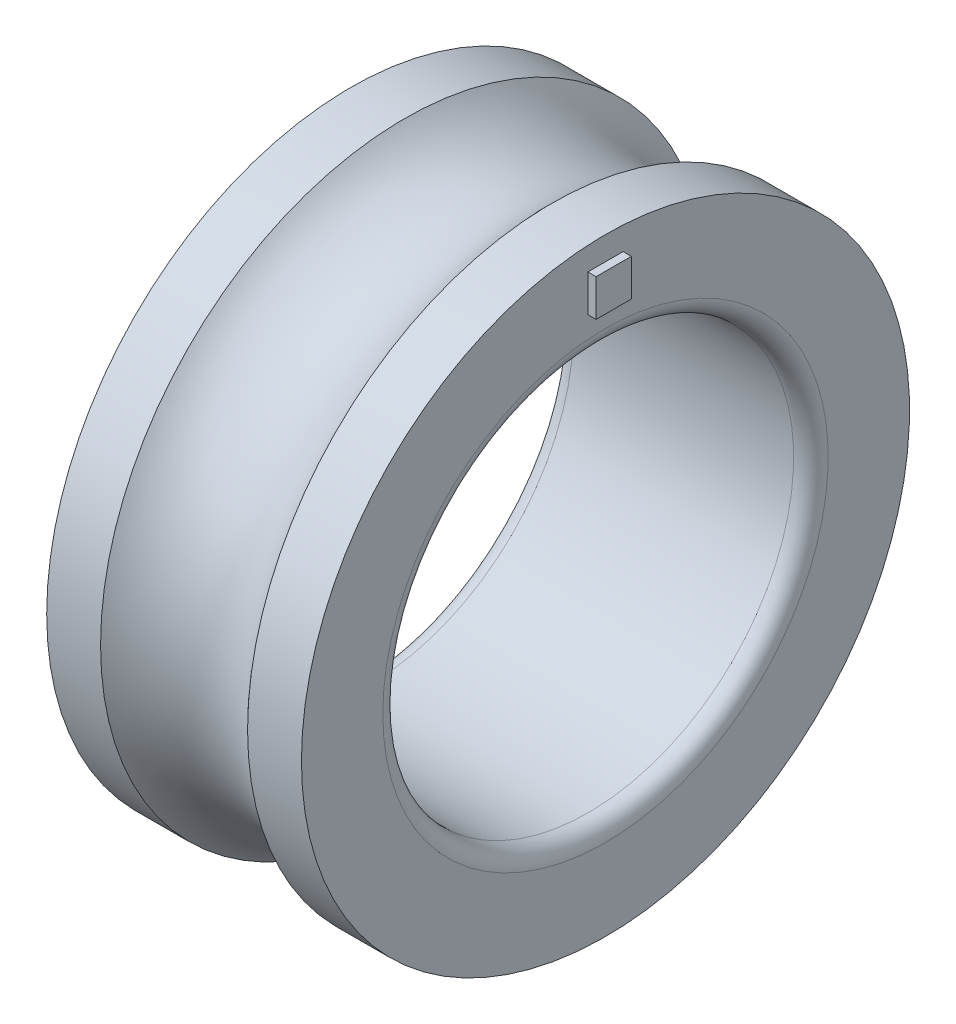
ISO-10303-21;
HEADER;
FILE_DESCRIPTION(('STEP AP214'),'2;1');
FILE_NAME('part.step','',(''),(''),'','','');
FILE_SCHEMA(('AUTOMOTIVE_DESIGN { 1 0 10303 214 1 1 1 1 }'));
ENDSEC;
DATA;
#1=APPLICATION_CONTEXT('core data for automotive mechanical design processes');
#2=APPLICATION_PROTOCOL_DEFINITION('international standard','automotive_design',2000,#1);
#3=PRODUCT_CONTEXT('',#1,'mechanical');
#4=PRODUCT('Part','Part','',(#3));
#5=PRODUCT_RELATED_PRODUCT_CATEGORY('part','',(#4));
#6=PRODUCT_DEFINITION_FORMATION('','',#4);
#7=PRODUCT_DEFINITION_CONTEXT('part definition',#1,'design');
#8=PRODUCT_DEFINITION('design','',#6,#7);
#9=PRODUCT_DEFINITION_SHAPE('','',#8);
#10=(LENGTH_UNIT() NAMED_UNIT(*) SI_UNIT(.MILLI.,.METRE.));
#11=(NAMED_UNIT(*) PLANE_ANGLE_UNIT() SI_UNIT($,.RADIAN.));
#12=(NAMED_UNIT(*) SI_UNIT($,.STERADIAN.) SOLID_ANGLE_UNIT());
#13=UNCERTAINTY_MEASURE_WITH_UNIT(LENGTH_MEASURE(1.E-05),#10,'distance_accuracy_value','');
#14=(GEOMETRIC_REPRESENTATION_CONTEXT(3) GLOBAL_UNCERTAINTY_ASSIGNED_CONTEXT((#13)) GLOBAL_UNIT_ASSIGNED_CONTEXT((#10,
#11,#12)) REPRESENTATION_CONTEXT('',''));
#15=CARTESIAN_POINT('',(0.,0.,0.));
#16=DIRECTION('',(0.,0.,1.));
#17=DIRECTION('',(1.,0.,0.));
#18=AXIS2_PLACEMENT_3D('',#15,#16,#17);
#19=CARTESIAN_POINT('',(15.5,37.,0.));
#20=DIRECTION('',(-1.,0.,0.));
#21=DIRECTION('',(0.,0.,1.));
#22=AXIS2_PLACEMENT_3D('',#19,#20,#21);
#23=PLANE('',#22);
#24=CARTESIAN_POINT('',(15.5,0.,0.));
#25=DIRECTION('',(-1.,0.,0.));
#26=DIRECTION('',(0.,0.,1.));
#27=AXIS2_PLACEMENT_3D('',#24,#25,#26);
#28=CIRCLE('',#27,27.1);
#29=CARTESIAN_POINT('',(15.5,0.,27.1));
#30=VERTEX_POINT('',#29);
#31=EDGE_CURVE('E133',#30,#30,#28,.T.);
#32=ORIENTED_EDGE('',*,*,#31,.T.);
#33=EDGE_LOOP('',(#32));
#34=FACE_BOUND('',#33,.T.);
#35=CARTESIAN_POINT('',(15.5,0.,0.));
#36=DIRECTION('',(-1.,0.,0.));
#37=DIRECTION('',(0.,0.,1.));
#38=AXIS2_PLACEMENT_3D('',#35,#36,#37);
#39=CIRCLE('',#38,37.);
#40=CARTESIAN_POINT('',(15.5,0.,37.));
#41=VERTEX_POINT('',#40);
#42=EDGE_CURVE('E129',#41,#41,#39,.T.);
#43=ORIENTED_EDGE('',*,*,#42,.F.);
#44=EDGE_LOOP('',(#43));
#45=FACE_BOUND('',#44,.T.);
#46=DIRECTION('',(0.,1.,0.));
#47=VECTOR('',#46,1.);
#48=CARTESIAN_POINT('',(15.5,29.6196598792772,-2.144689404489));
#49=LINE('',#48,#47);
#50=CARTESIAN_POINT('',(15.5,29.6196598792772,-2.144689404489));
#51=VERTEX_POINT('',#50);
#52=CARTESIAN_POINT('',(15.5,34.1235076287041,-2.144689404489));
#53=VERTEX_POINT('',#52);
#54=EDGE_CURVE('E109',#51,#53,#49,.T.);
#55=ORIENTED_EDGE('',*,*,#54,.F.);
#56=DIRECTION('',(0.,0.,-1.));
#57=VECTOR('',#56,1.);
#58=CARTESIAN_POINT('',(15.5,29.6196598792772,2.144689404489));
#59=LINE('',#58,#57);
#60=CARTESIAN_POINT('',(15.5,29.6196598792772,2.144689404489));
#61=VERTEX_POINT('',#60);
#62=EDGE_CURVE('E106',#61,#51,#59,.T.);
#63=ORIENTED_EDGE('',*,*,#62,.F.);
#64=DIRECTION('',(0.,-1.,0.));
#65=VECTOR('',#64,1.);
#66=CARTESIAN_POINT('',(15.5,29.6196598792772,2.144689404489));
#67=LINE('',#66,#65);
#68=CARTESIAN_POINT('',(15.5,34.1235076287041,2.144689404489));
#69=VERTEX_POINT('',#68);
#70=EDGE_CURVE('E66',#69,#61,#67,.T.);
#71=ORIENTED_EDGE('',*,*,#70,.F.);
#72=DIRECTION('',(0.,0.,1.));
#73=VECTOR('',#72,1.);
#74=CARTESIAN_POINT('',(15.5,34.1235076287041,2.144689404489));
#75=LINE('',#74,#73);
#76=EDGE_CURVE('E61',#53,#69,#75,.T.);
#77=ORIENTED_EDGE('',*,*,#76,.F.);
#78=EDGE_LOOP('',(#55,#63,#71,#77));
#79=FACE_BOUND('',#78,.T.);
#80=ADVANCED_FACE('F45',(#34,#45,#79),#23,.F.);
#81=CARTESIAN_POINT('',(-15.5,37.,0.));
#82=DIRECTION('',(1.,0.,0.));
#83=DIRECTION('',(0.,0.,-1.));
#84=AXIS2_PLACEMENT_3D('',#81,#82,#83);
#85=PLANE('',#84);
#86=CARTESIAN_POINT('',(-15.5,0.,0.));
#87=DIRECTION('',(-1.,0.,0.));
#88=DIRECTION('',(0.,0.,1.));
#89=AXIS2_PLACEMENT_3D('',#86,#87,#88);
#90=CIRCLE('',#89,27.1);
#91=CARTESIAN_POINT('',(-15.5,0.,27.1));
#92=VERTEX_POINT('',#91);
#93=EDGE_CURVE('E11',#92,#92,#90,.T.);
#94=ORIENTED_EDGE('',*,*,#93,.F.);
#95=EDGE_LOOP('',(#94));
#96=FACE_BOUND('',#95,.T.);
#97=CARTESIAN_POINT('',(-15.5,0.,0.));
#98=DIRECTION('',(-1.,0.,0.));
#99=DIRECTION('',(0.,0.,1.));
#100=AXIS2_PLACEMENT_3D('',#97,#98,#99);
#101=CIRCLE('',#100,37.);
#102=CARTESIAN_POINT('',(-15.5,0.,37.));
#103=VERTEX_POINT('',#102);
#104=EDGE_CURVE('E111',#103,#103,#101,.T.);
#105=ORIENTED_EDGE('',*,*,#104,.T.);
#106=EDGE_LOOP('',(#105));
#107=FACE_BOUND('',#106,.T.);
#108=ADVANCED_FACE('F47',(#96,#107),#85,.F.);
#109=CARTESIAN_POINT('',(-13.4,0.,0.));
#110=DIRECTION('',(-1.,0.,0.));
#111=DIRECTION('',(0.,0.,1.));
#112=AXIS2_PLACEMENT_3D('',#109,#110,#111);
#113=TOROIDAL_SURFACE('',#112,27.1,2.1);
#114=CARTESIAN_POINT('',(-13.4,0.,0.));
#115=DIRECTION('',(-1.,0.,0.));
#116=DIRECTION('',(0.,0.,1.));
#117=AXIS2_PLACEMENT_3D('',#114,#115,#116);
#118=CIRCLE('',#117,25.);
#119=CARTESIAN_POINT('',(-13.4,0.,25.));
#120=VERTEX_POINT('',#119);
#121=EDGE_CURVE('E54',#120,#120,#118,.T.);
#122=ORIENTED_EDGE('',*,*,#121,.F.);
#123=EDGE_LOOP('',(#122));
#124=FACE_BOUND('',#123,.T.);
#125=ORIENTED_EDGE('',*,*,#93,.T.);
#126=EDGE_LOOP('',(#125));
#127=FACE_BOUND('',#126,.T.);
#128=ADVANCED_FACE('F146',(#124,#127),#113,.T.);
#129=CARTESIAN_POINT('',(-15.1463878326996,0.,0.));
#130=DIRECTION('',(-1.,0.,0.));
#131=DIRECTION('',(0.,0.,1.));
#132=AXIS2_PLACEMENT_3D('',#129,#130,#131);
#133=CYLINDRICAL_SURFACE('',#132,25.);
#134=CARTESIAN_POINT('',(13.4,0.,0.));
#135=DIRECTION('',(-1.,0.,0.));
#136=DIRECTION('',(0.,0.,1.));
#137=AXIS2_PLACEMENT_3D('',#134,#135,#136);
#138=CIRCLE('',#137,25.);
#139=CARTESIAN_POINT('',(13.4,0.,25.));
#140=VERTEX_POINT('',#139);
#141=EDGE_CURVE('E137',#140,#140,#138,.T.);
#142=ORIENTED_EDGE('',*,*,#141,.F.);
#143=EDGE_LOOP('',(#142));
#144=FACE_BOUND('',#143,.T.);
#145=ORIENTED_EDGE('',*,*,#121,.T.);
#146=EDGE_LOOP('',(#145));
#147=FACE_BOUND('',#146,.T.);
#148=ADVANCED_FACE('F144',(#144,#147),#133,.F.);
#149=CARTESIAN_POINT('',(13.4,0.,0.));
#150=DIRECTION('',(-1.,0.,0.));
#151=DIRECTION('',(0.,0.,1.));
#152=AXIS2_PLACEMENT_3D('',#149,#150,#151);
#153=TOROIDAL_SURFACE('',#152,27.1,2.1);
#154=ORIENTED_EDGE('',*,*,#31,.F.);
#155=EDGE_LOOP('',(#154));
#156=FACE_BOUND('',#155,.T.);
#157=ORIENTED_EDGE('',*,*,#141,.T.);
#158=EDGE_LOOP('',(#157));
#159=FACE_BOUND('',#158,.T.);
#160=ADVANCED_FACE('F170',(#156,#159),#153,.T.);
#161=CARTESIAN_POINT('',(-15.1463878326996,0.,0.));
#162=DIRECTION('',(-1.,0.,0.));
#163=DIRECTION('',(0.,0.,1.));
#164=AXIS2_PLACEMENT_3D('',#161,#162,#163);
#165=CYLINDRICAL_SURFACE('',#164,37.);
#166=CARTESIAN_POINT('',(8.94427190999916,0.,0.));
#167=DIRECTION('',(-1.,0.,0.));
#168=DIRECTION('',(0.,0.,1.));
#169=AXIS2_PLACEMENT_3D('',#166,#167,#168);
#170=CIRCLE('',#169,37.);
#171=CARTESIAN_POINT('',(8.94427190999916,0.,37.));
#172=VERTEX_POINT('',#171);
#173=EDGE_CURVE('E125',#172,#172,#170,.T.);
#174=ORIENTED_EDGE('',*,*,#173,.F.);
#175=EDGE_LOOP('',(#174));
#176=FACE_BOUND('',#175,.T.);
#177=ORIENTED_EDGE('',*,*,#42,.T.);
#178=EDGE_LOOP('',(#177));
#179=FACE_BOUND('',#178,.T.);
#180=ADVANCED_FACE('F164',(#176,#179),#165,.T.);
#181=CARTESIAN_POINT('',(0.,0.,0.));
#182=DIRECTION('',(-1.,0.,0.));
#183=DIRECTION('',(0.,0.,1.));
#184=AXIS2_PLACEMENT_3D('',#181,#182,#183);
#185=TOROIDAL_SURFACE('',#184,45.,12.);
#186=CARTESIAN_POINT('',(-8.94427190999916,0.,0.));
#187=DIRECTION('',(-1.,0.,0.));
#188=DIRECTION('',(0.,0.,1.));
#189=AXIS2_PLACEMENT_3D('',#186,#187,#188);
#190=CIRCLE('',#189,37.);
#191=CARTESIAN_POINT('',(-8.94427190999916,0.,37.));
#192=VERTEX_POINT('',#191);
#193=EDGE_CURVE('E116',#192,#192,#190,.T.);
#194=ORIENTED_EDGE('',*,*,#193,.F.);
#195=EDGE_LOOP('',(#194));
#196=FACE_BOUND('',#195,.T.);
#197=ORIENTED_EDGE('',*,*,#173,.T.);
#198=EDGE_LOOP('',(#197));
#199=FACE_BOUND('',#198,.T.);
#200=ADVANCED_FACE('F158',(#196,#199),#185,.F.);
#201=CARTESIAN_POINT('',(-15.1463878326996,0.,0.));
#202=DIRECTION('',(-1.,0.,0.));
#203=DIRECTION('',(0.,0.,1.));
#204=AXIS2_PLACEMENT_3D('',#201,#202,#203);
#205=CYLINDRICAL_SURFACE('',#204,37.);
#206=ORIENTED_EDGE('',*,*,#104,.F.);
#207=EDGE_LOOP('',(#206));
#208=FACE_BOUND('',#207,.T.);
#209=ORIENTED_EDGE('',*,*,#193,.T.);
#210=EDGE_LOOP('',(#209));
#211=FACE_BOUND('',#210,.T.);
#212=ADVANCED_FACE('F155',(#208,#211),#205,.T.);
#213=CARTESIAN_POINT('',(16.5,29.6196598792772,-2.144689404489));
#214=DIRECTION('',(0.,0.,1.));
#215=DIRECTION('',(1.,0.,0.));
#216=AXIS2_PLACEMENT_3D('',#213,#214,#215);
#217=PLANE('',#216);
#218=ORIENTED_EDGE('',*,*,#54,.T.);
#219=DIRECTION('',(-1.,0.,0.));
#220=VECTOR('',#219,1.);
#221=CARTESIAN_POINT('',(16.5,34.1235076287041,-2.144689404489));
#222=LINE('',#221,#220);
#223=CARTESIAN_POINT('',(16.5,34.1235076287041,-2.144689404489));
#224=VERTEX_POINT('',#223);
#225=EDGE_CURVE('E88',#224,#53,#222,.T.);
#226=ORIENTED_EDGE('',*,*,#225,.F.);
#227=DIRECTION('',(0.,1.,0.));
#228=VECTOR('',#227,1.);
#229=CARTESIAN_POINT('',(16.5,29.6196598792772,-2.144689404489));
#230=LINE('',#229,#228);
#231=CARTESIAN_POINT('',(16.5,29.6196598792772,-2.144689404489));
#232=VERTEX_POINT('',#231);
#233=EDGE_CURVE('E96',#232,#224,#230,.T.);
#234=ORIENTED_EDGE('',*,*,#233,.F.);
#235=DIRECTION('',(-1.,0.,0.));
#236=VECTOR('',#235,1.);
#237=CARTESIAN_POINT('',(16.5,29.6196598792772,-2.144689404489));
#238=LINE('',#237,#236);
#239=EDGE_CURVE('E183',#232,#51,#238,.T.);
#240=ORIENTED_EDGE('',*,*,#239,.T.);
#241=EDGE_LOOP('',(#218,#226,#234,#240));
#242=FACE_BOUND('',#241,.T.);
#243=ADVANCED_FACE('F108',(#242),#217,.F.);
#244=CARTESIAN_POINT('',(16.5,34.1235076287041,2.144689404489));
#245=DIRECTION('',(0.,-1.,0.));
#246=DIRECTION('',(0.,0.,-1.));
#247=AXIS2_PLACEMENT_3D('',#244,#245,#246);
#248=PLANE('',#247);
#249=ORIENTED_EDGE('',*,*,#76,.T.);
#250=DIRECTION('',(-1.,0.,0.));
#251=VECTOR('',#250,1.);
#252=CARTESIAN_POINT('',(16.5,34.1235076287041,2.144689404489));
#253=LINE('',#252,#251);
#254=CARTESIAN_POINT('',(16.5,34.1235076287041,2.144689404489));
#255=VERTEX_POINT('',#254);
#256=EDGE_CURVE('E91',#255,#69,#253,.T.);
#257=ORIENTED_EDGE('',*,*,#256,.F.);
#258=DIRECTION('',(0.,0.,1.));
#259=VECTOR('',#258,1.);
#260=CARTESIAN_POINT('',(16.5,34.1235076287041,2.144689404489));
#261=LINE('',#260,#259);
#262=EDGE_CURVE('E84',#224,#255,#261,.T.);
#263=ORIENTED_EDGE('',*,*,#262,.F.);
#264=ORIENTED_EDGE('',*,*,#225,.T.);
#265=EDGE_LOOP('',(#249,#257,#263,#264));
#266=FACE_BOUND('',#265,.T.);
#267=ADVANCED_FACE('F86',(#266),#248,.F.);
#268=CARTESIAN_POINT('',(16.5,29.6196598792772,2.144689404489));
#269=DIRECTION('',(0.,0.,-1.));
#270=DIRECTION('',(-1.,0.,0.));
#271=AXIS2_PLACEMENT_3D('',#268,#269,#270);
#272=PLANE('',#271);
#273=ORIENTED_EDGE('',*,*,#70,.T.);
#274=DIRECTION('',(-1.,0.,0.));
#275=VECTOR('',#274,1.);
#276=CARTESIAN_POINT('',(16.5,29.6196598792772,2.144689404489));
#277=LINE('',#276,#275);
#278=CARTESIAN_POINT('',(16.5,29.6196598792772,2.144689404489));
#279=VERTEX_POINT('',#278);
#280=EDGE_CURVE('E118',#279,#61,#277,.T.);
#281=ORIENTED_EDGE('',*,*,#280,.F.);
#282=DIRECTION('',(0.,-1.,0.));
#283=VECTOR('',#282,1.);
#284=CARTESIAN_POINT('',(16.5,29.6196598792772,2.144689404489));
#285=LINE('',#284,#283);
#286=EDGE_CURVE('E95',#255,#279,#285,.T.);
#287=ORIENTED_EDGE('',*,*,#286,.F.);
#288=ORIENTED_EDGE('',*,*,#256,.T.);
#289=EDGE_LOOP('',(#273,#281,#287,#288));
#290=FACE_BOUND('',#289,.T.);
#291=ADVANCED_FACE('F199',(#290),#272,.F.);
#292=CARTESIAN_POINT('',(16.5,29.6196598792772,2.144689404489));
#293=DIRECTION('',(0.,1.,0.));
#294=DIRECTION('',(0.,0.,1.));
#295=AXIS2_PLACEMENT_3D('',#292,#293,#294);
#296=PLANE('',#295);
#297=ORIENTED_EDGE('',*,*,#62,.T.);
#298=ORIENTED_EDGE('',*,*,#239,.F.);
#299=DIRECTION('',(0.,0.,-1.));
#300=VECTOR('',#299,1.);
#301=CARTESIAN_POINT('',(16.5,29.6196598792772,2.144689404489));
#302=LINE('',#301,#300);
#303=EDGE_CURVE('E101',#279,#232,#302,.T.);
#304=ORIENTED_EDGE('',*,*,#303,.F.);
#305=ORIENTED_EDGE('',*,*,#280,.T.);
#306=EDGE_LOOP('',(#297,#298,#304,#305));
#307=FACE_BOUND('',#306,.T.);
#308=ADVANCED_FACE('F182',(#307),#296,.F.);
#309=CARTESIAN_POINT('',(16.5,0.,0.));
#310=DIRECTION('',(-1.,0.,0.));
#311=DIRECTION('',(0.,0.,1.));
#312=AXIS2_PLACEMENT_3D('',#309,#310,#311);
#313=PLANE('',#312);
#314=ORIENTED_EDGE('',*,*,#233,.T.);
#315=ORIENTED_EDGE('',*,*,#262,.T.);
#316=ORIENTED_EDGE('',*,*,#286,.T.);
#317=ORIENTED_EDGE('',*,*,#303,.T.);
#318=EDGE_LOOP('',(#314,#315,#316,#317));
#319=FACE_BOUND('',#318,.T.);
#320=ADVANCED_FACE('F99',(#319),#313,.F.);
#321=CLOSED_SHELL('',(#80,#108,#128,#148,#160,#180,#200,#212,#243,#267,#291,#308,#320));
#322=MANIFOLD_SOLID_BREP('B2',#321);
#323=ADVANCED_BREP_SHAPE_REPRESENTATION('',(#18,#322),#14);
#324=SHAPE_DEFINITION_REPRESENTATION(#9,#323);
ENDSEC;
END-ISO-10303-21;
